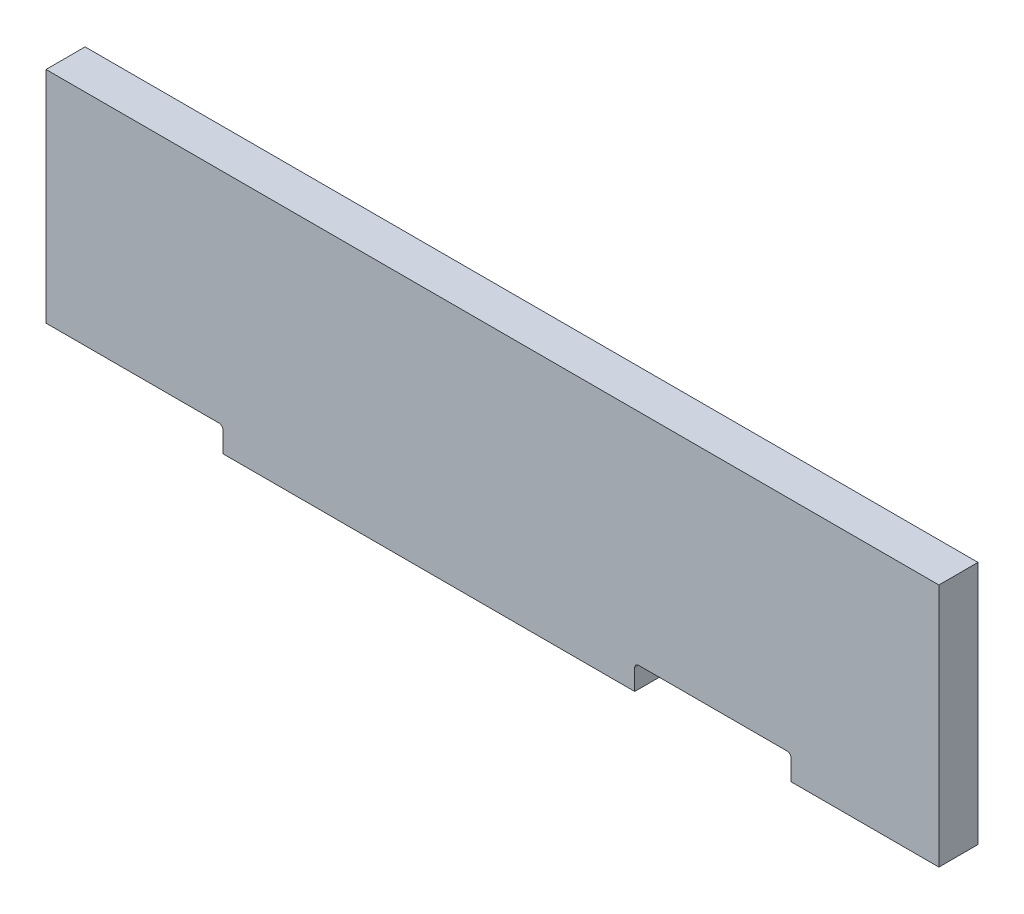
ISO-10303-21;
HEADER;
FILE_DESCRIPTION(('STEP AP214'),'2;1');
FILE_NAME('part.step','',(''),(''),'','','');
FILE_SCHEMA(('AUTOMOTIVE_DESIGN { 1 0 10303 214 1 1 1 1 }'));
ENDSEC;
DATA;
#1=APPLICATION_CONTEXT('core data for automotive mechanical design processes');
#2=APPLICATION_PROTOCOL_DEFINITION('international standard','automotive_design',2000,#1);
#3=PRODUCT_CONTEXT('',#1,'mechanical');
#4=PRODUCT('Part','Part','',(#3));
#5=PRODUCT_RELATED_PRODUCT_CATEGORY('part','',(#4));
#6=PRODUCT_DEFINITION_FORMATION('','',#4);
#7=PRODUCT_DEFINITION_CONTEXT('part definition',#1,'design');
#8=PRODUCT_DEFINITION('design','',#6,#7);
#9=PRODUCT_DEFINITION_SHAPE('','',#8);
#10=(LENGTH_UNIT() NAMED_UNIT(*) SI_UNIT(.MILLI.,.METRE.));
#11=(NAMED_UNIT(*) PLANE_ANGLE_UNIT() SI_UNIT($,.RADIAN.));
#12=(NAMED_UNIT(*) SI_UNIT($,.STERADIAN.) SOLID_ANGLE_UNIT());
#13=UNCERTAINTY_MEASURE_WITH_UNIT(LENGTH_MEASURE(1.E-05),#10,'distance_accuracy_value','');
#14=(GEOMETRIC_REPRESENTATION_CONTEXT(3) GLOBAL_UNCERTAINTY_ASSIGNED_CONTEXT((#13)) GLOBAL_UNIT_ASSIGNED_CONTEXT((#10,
#11,#12)) REPRESENTATION_CONTEXT('',''));
#15=CARTESIAN_POINT('',(0.,0.,0.));
#16=DIRECTION('',(0.,0.,1.));
#17=DIRECTION('',(1.,0.,0.));
#18=AXIS2_PLACEMENT_3D('',#15,#16,#17);
#19=CARTESIAN_POINT('',(300.,0.,19.05));
#20=DIRECTION('',(0.,1.,0.));
#21=DIRECTION('',(0.,0.,1.));
#22=AXIS2_PLACEMENT_3D('',#19,#20,#21);
#23=PLANE('',#22);
#24=DIRECTION('',(1.,0.,0.));
#25=VECTOR('',#24,1.);
#26=CARTESIAN_POINT('',(300.,0.,19.05));
#27=LINE('',#26,#25);
#28=CARTESIAN_POINT('',(-48.8000000000001,0.,19.05));
#29=VERTEX_POINT('',#28);
#30=CARTESIAN_POINT('',(151.8,0.,19.05));
#31=VERTEX_POINT('',#30);
#32=EDGE_CURVE('E140',#29,#31,#27,.T.);
#33=ORIENTED_EDGE('',*,*,#32,.F.);
#34=DIRECTION('',(0.,0.,1.));
#35=VECTOR('',#34,1.);
#36=CARTESIAN_POINT('',(-48.8000000000001,0.,0.));
#37=LINE('',#36,#35);
#38=CARTESIAN_POINT('',(-48.8000000000001,0.,0.));
#39=VERTEX_POINT('',#38);
#40=EDGE_CURVE('E127',#39,#29,#37,.T.);
#41=ORIENTED_EDGE('',*,*,#40,.F.);
#42=DIRECTION('',(1.,0.,0.));
#43=VECTOR('',#42,1.);
#44=CARTESIAN_POINT('',(300.,0.,0.));
#45=LINE('',#44,#43);
#46=CARTESIAN_POINT('',(151.8,0.,0.));
#47=VERTEX_POINT('',#46);
#48=EDGE_CURVE('E138',#39,#47,#45,.T.);
#49=ORIENTED_EDGE('',*,*,#48,.T.);
#50=DIRECTION('',(0.,0.,1.));
#51=VECTOR('',#50,1.);
#52=CARTESIAN_POINT('',(151.8,0.,0.));
#53=LINE('',#52,#51);
#54=EDGE_CURVE('E221',#47,#31,#53,.T.);
#55=ORIENTED_EDGE('',*,*,#54,.T.);
#56=EDGE_LOOP('',(#33,#41,#49,#55));
#57=FACE_BOUND('',#56,.T.);
#58=ADVANCED_FACE('F33',(#57),#23,.F.);
#59=CARTESIAN_POINT('',(300.,0.,19.05));
#60=DIRECTION('',(-1.,0.,0.));
#61=DIRECTION('',(0.,0.,1.));
#62=AXIS2_PLACEMENT_3D('',#59,#60,#61);
#63=PLANE('',#62);
#64=DIRECTION('',(0.,1.,0.));
#65=VECTOR('',#64,1.);
#66=CARTESIAN_POINT('',(300.,0.,0.));
#67=LINE('',#66,#65);
#68=CARTESIAN_POINT('',(300.,0.,0.));
#69=VERTEX_POINT('',#68);
#70=CARTESIAN_POINT('',(300.,119.05,0.));
#71=VERTEX_POINT('',#70);
#72=EDGE_CURVE('E231',#69,#71,#67,.T.);
#73=ORIENTED_EDGE('',*,*,#72,.T.);
#74=DIRECTION('',(0.,0.,-1.));
#75=VECTOR('',#74,1.);
#76=CARTESIAN_POINT('',(300.,119.05,19.05));
#77=LINE('',#76,#75);
#78=CARTESIAN_POINT('',(300.,119.05,19.05));
#79=VERTEX_POINT('',#78);
#80=EDGE_CURVE('E163',#79,#71,#77,.T.);
#81=ORIENTED_EDGE('',*,*,#80,.F.);
#82=DIRECTION('',(0.,1.,0.));
#83=VECTOR('',#82,1.);
#84=CARTESIAN_POINT('',(300.,0.,19.05));
#85=LINE('',#84,#83);
#86=CARTESIAN_POINT('',(300.,0.,19.05));
#87=VERTEX_POINT('',#86);
#88=EDGE_CURVE('E147',#87,#79,#85,.T.);
#89=ORIENTED_EDGE('',*,*,#88,.F.);
#90=DIRECTION('',(0.,0.,-1.));
#91=VECTOR('',#90,1.);
#92=CARTESIAN_POINT('',(300.,0.,19.05));
#93=LINE('',#92,#91);
#94=EDGE_CURVE('E157',#87,#69,#93,.T.);
#95=ORIENTED_EDGE('',*,*,#94,.T.);
#96=EDGE_LOOP('',(#73,#81,#89,#95));
#97=FACE_BOUND('',#96,.T.);
#98=ADVANCED_FACE('F258',(#97),#63,.F.);
#99=CARTESIAN_POINT('',(300.,119.05,19.05));
#100=DIRECTION('',(0.,-1.,0.));
#101=DIRECTION('',(0.,0.,-1.));
#102=AXIS2_PLACEMENT_3D('',#99,#100,#101);
#103=PLANE('',#102);
#104=DIRECTION('',(-1.,0.,0.));
#105=VECTOR('',#104,1.);
#106=CARTESIAN_POINT('',(300.,119.05,0.));
#107=LINE('',#106,#105);
#108=CARTESIAN_POINT('',(-135.,119.05,0.));
#109=VERTEX_POINT('',#108);
#110=EDGE_CURVE('E233',#71,#109,#107,.T.);
#111=ORIENTED_EDGE('',*,*,#110,.T.);
#112=DIRECTION('',(0.,0.,-1.));
#113=VECTOR('',#112,1.);
#114=CARTESIAN_POINT('',(-135.,119.05,19.05));
#115=LINE('',#114,#113);
#116=CARTESIAN_POINT('',(-135.,119.05,19.05));
#117=VERTEX_POINT('',#116);
#118=EDGE_CURVE('E160',#117,#109,#115,.T.);
#119=ORIENTED_EDGE('',*,*,#118,.F.);
#120=DIRECTION('',(-1.,0.,0.));
#121=VECTOR('',#120,1.);
#122=CARTESIAN_POINT('',(300.,119.05,19.05));
#123=LINE('',#122,#121);
#124=EDGE_CURVE('E151',#79,#117,#123,.T.);
#125=ORIENTED_EDGE('',*,*,#124,.F.);
#126=ORIENTED_EDGE('',*,*,#80,.T.);
#127=EDGE_LOOP('',(#111,#119,#125,#126));
#128=FACE_BOUND('',#127,.T.);
#129=ADVANCED_FACE('F256',(#128),#103,.F.);
#130=CARTESIAN_POINT('',(-135.,0.,19.05));
#131=DIRECTION('',(1.,0.,0.));
#132=DIRECTION('',(0.,0.,-1.));
#133=AXIS2_PLACEMENT_3D('',#130,#131,#132);
#134=PLANE('',#133);
#135=DIRECTION('',(0.,-1.,0.));
#136=VECTOR('',#135,1.);
#137=CARTESIAN_POINT('',(-135.,0.,0.));
#138=LINE('',#137,#136);
#139=CARTESIAN_POINT('',(-135.,12.,0.));
#140=VERTEX_POINT('',#139);
#141=EDGE_CURVE('E153',#109,#140,#138,.T.);
#142=ORIENTED_EDGE('',*,*,#141,.T.);
#143=DIRECTION('',(0.,0.,1.));
#144=VECTOR('',#143,1.);
#145=CARTESIAN_POINT('',(-135.,12.,0.));
#146=LINE('',#145,#144);
#147=CARTESIAN_POINT('',(-135.,12.,19.05));
#148=VERTEX_POINT('',#147);
#149=EDGE_CURVE('E141',#140,#148,#146,.T.);
#150=ORIENTED_EDGE('',*,*,#149,.T.);
#151=DIRECTION('',(0.,-1.,0.));
#152=VECTOR('',#151,1.);
#153=CARTESIAN_POINT('',(-135.,0.,19.05));
#154=LINE('',#153,#152);
#155=EDGE_CURVE('E226',#117,#148,#154,.T.);
#156=ORIENTED_EDGE('',*,*,#155,.F.);
#157=ORIENTED_EDGE('',*,*,#118,.T.);
#158=EDGE_LOOP('',(#142,#150,#156,#157));
#159=FACE_BOUND('',#158,.T.);
#160=ADVANCED_FACE('F240',(#159),#134,.F.);
#161=CARTESIAN_POINT('',(228.,0.,19.05));
#162=VERTEX_POINT('',#161);
#163=EDGE_CURVE('E229',#162,#87,#27,.T.);
#164=ORIENTED_EDGE('',*,*,#163,.F.);
#165=DIRECTION('',(0.,0.,1.));
#166=VECTOR('',#165,1.);
#167=CARTESIAN_POINT('',(228.,0.,0.));
#168=LINE('',#167,#166);
#169=CARTESIAN_POINT('',(228.,0.,0.));
#170=VERTEX_POINT('',#169);
#171=EDGE_CURVE('E214',#170,#162,#168,.T.);
#172=ORIENTED_EDGE('',*,*,#171,.F.);
#173=EDGE_CURVE('E148',#170,#69,#45,.T.);
#174=ORIENTED_EDGE('',*,*,#173,.T.);
#175=ORIENTED_EDGE('',*,*,#94,.F.);
#176=EDGE_LOOP('',(#164,#172,#174,#175));
#177=FACE_BOUND('',#176,.T.);
#178=ADVANCED_FACE('F264',(#177),#23,.F.);
#179=CARTESIAN_POINT('',(0.,0.,19.05));
#180=DIRECTION('',(0.,0.,1.));
#181=DIRECTION('',(1.,0.,0.));
#182=AXIS2_PLACEMENT_3D('',#179,#180,#181);
#183=PLANE('',#182);
#184=DIRECTION('',(-1.,0.,0.));
#185=VECTOR('',#184,1.);
#186=CARTESIAN_POINT('',(-125.,12.,19.05));
#187=LINE('',#186,#185);
#188=CARTESIAN_POINT('',(-50.8000000000001,12.,19.05));
#189=VERTEX_POINT('',#188);
#190=EDGE_CURVE('E132',#189,#148,#187,.T.);
#191=ORIENTED_EDGE('',*,*,#190,.F.);
#192=CARTESIAN_POINT('',(-50.8000000000001,10.,19.05));
#193=DIRECTION('',(0.,0.,1.));
#194=DIRECTION('',(1.,0.,0.));
#195=AXIS2_PLACEMENT_3D('',#192,#193,#194);
#196=CIRCLE('',#195,2.);
#197=CARTESIAN_POINT('',(-48.8000000000001,9.99999999999999,19.05));
#198=VERTEX_POINT('',#197);
#199=EDGE_CURVE('E41',#189,#198,#196,.F.);
#200=ORIENTED_EDGE('',*,*,#199,.T.);
#201=DIRECTION('',(0.,1.,0.));
#202=VECTOR('',#201,1.);
#203=CARTESIAN_POINT('',(-48.8000000000001,0.,19.05));
#204=LINE('',#203,#202);
#205=EDGE_CURVE('E223',#29,#198,#204,.T.);
#206=ORIENTED_EDGE('',*,*,#205,.F.);
#207=ORIENTED_EDGE('',*,*,#32,.T.);
#208=DIRECTION('',(0.,-1.,0.));
#209=VECTOR('',#208,1.);
#210=CARTESIAN_POINT('',(151.8,0.,19.05));
#211=LINE('',#210,#209);
#212=CARTESIAN_POINT('',(151.8,9.99999999999996,19.05));
#213=VERTEX_POINT('',#212);
#214=EDGE_CURVE('E216',#213,#31,#211,.T.);
#215=ORIENTED_EDGE('',*,*,#214,.F.);
#216=CARTESIAN_POINT('',(153.8,9.99999999999996,19.05));
#217=DIRECTION('',(0.,0.,1.));
#218=DIRECTION('',(1.,0.,0.));
#219=AXIS2_PLACEMENT_3D('',#216,#217,#218);
#220=CIRCLE('',#219,2.);
#221=CARTESIAN_POINT('',(153.8,12.,19.05));
#222=VERTEX_POINT('',#221);
#223=EDGE_CURVE('E180',#213,#222,#220,.F.);
#224=ORIENTED_EDGE('',*,*,#223,.T.);
#225=DIRECTION('',(-1.,0.,0.));
#226=VECTOR('',#225,1.);
#227=CARTESIAN_POINT('',(151.8,12.,19.05));
#228=LINE('',#227,#226);
#229=CARTESIAN_POINT('',(226.,12.,19.05));
#230=VERTEX_POINT('',#229);
#231=EDGE_CURVE('E210',#230,#222,#228,.T.);
#232=ORIENTED_EDGE('',*,*,#231,.F.);
#233=CARTESIAN_POINT('',(226.,9.99999999999996,19.05));
#234=DIRECTION('',(0.,0.,1.));
#235=DIRECTION('',(1.,0.,0.));
#236=AXIS2_PLACEMENT_3D('',#233,#234,#235);
#237=CIRCLE('',#236,2.);
#238=CARTESIAN_POINT('',(228.,9.99999999999996,19.05));
#239=VERTEX_POINT('',#238);
#240=EDGE_CURVE('E184',#230,#239,#237,.F.);
#241=ORIENTED_EDGE('',*,*,#240,.T.);
#242=DIRECTION('',(0.,1.,0.));
#243=VECTOR('',#242,1.);
#244=CARTESIAN_POINT('',(228.,12.,19.05));
#245=LINE('',#244,#243);
#246=EDGE_CURVE('E208',#162,#239,#245,.T.);
#247=ORIENTED_EDGE('',*,*,#246,.F.);
#248=ORIENTED_EDGE('',*,*,#163,.T.);
#249=ORIENTED_EDGE('',*,*,#88,.T.);
#250=ORIENTED_EDGE('',*,*,#124,.T.);
#251=ORIENTED_EDGE('',*,*,#155,.T.);
#252=EDGE_LOOP('',(#191,#200,#206,#207,#215,#224,#232,#241,#247,#248,#249,#250,#251));
#253=FACE_BOUND('',#252,.T.);
#254=ADVANCED_FACE('F207',(#253),#183,.T.);
#255=CARTESIAN_POINT('',(0.,0.,0.));
#256=DIRECTION('',(0.,0.,1.));
#257=DIRECTION('',(1.,0.,0.));
#258=AXIS2_PLACEMENT_3D('',#255,#256,#257);
#259=PLANE('',#258);
#260=DIRECTION('',(0.,1.,0.));
#261=VECTOR('',#260,1.);
#262=CARTESIAN_POINT('',(-48.8000000000001,0.,0.));
#263=LINE('',#262,#261);
#264=CARTESIAN_POINT('',(-48.8000000000001,9.99999999999999,0.));
#265=VERTEX_POINT('',#264);
#266=EDGE_CURVE('E124',#39,#265,#263,.T.);
#267=ORIENTED_EDGE('',*,*,#266,.T.);
#268=CARTESIAN_POINT('',(-50.8000000000001,10.,0.));
#269=DIRECTION('',(0.,0.,1.));
#270=DIRECTION('',(1.,0.,0.));
#271=AXIS2_PLACEMENT_3D('',#268,#269,#270);
#272=CIRCLE('',#271,2.);
#273=CARTESIAN_POINT('',(-50.8000000000001,12.,0.));
#274=VERTEX_POINT('',#273);
#275=EDGE_CURVE('E11',#265,#274,#272,.T.);
#276=ORIENTED_EDGE('',*,*,#275,.T.);
#277=DIRECTION('',(-1.,0.,0.));
#278=VECTOR('',#277,1.);
#279=CARTESIAN_POINT('',(-48.8000000000001,12.,0.));
#280=LINE('',#279,#278);
#281=EDGE_CURVE('E131',#274,#140,#280,.T.);
#282=ORIENTED_EDGE('',*,*,#281,.T.);
#283=ORIENTED_EDGE('',*,*,#141,.F.);
#284=ORIENTED_EDGE('',*,*,#110,.F.);
#285=ORIENTED_EDGE('',*,*,#72,.F.);
#286=ORIENTED_EDGE('',*,*,#173,.F.);
#287=DIRECTION('',(0.,1.,0.));
#288=VECTOR('',#287,1.);
#289=CARTESIAN_POINT('',(228.,12.,0.));
#290=LINE('',#289,#288);
#291=CARTESIAN_POINT('',(228.,9.99999999999996,0.));
#292=VERTEX_POINT('',#291);
#293=EDGE_CURVE('E194',#170,#292,#290,.T.);
#294=ORIENTED_EDGE('',*,*,#293,.T.);
#295=CARTESIAN_POINT('',(226.,9.99999999999996,0.));
#296=DIRECTION('',(0.,0.,1.));
#297=DIRECTION('',(1.,0.,0.));
#298=AXIS2_PLACEMENT_3D('',#295,#296,#297);
#299=CIRCLE('',#298,2.);
#300=CARTESIAN_POINT('',(226.,12.,0.));
#301=VERTEX_POINT('',#300);
#302=EDGE_CURVE('E186',#292,#301,#299,.T.);
#303=ORIENTED_EDGE('',*,*,#302,.T.);
#304=DIRECTION('',(-1.,0.,0.));
#305=VECTOR('',#304,1.);
#306=CARTESIAN_POINT('',(151.8,12.,0.));
#307=LINE('',#306,#305);
#308=CARTESIAN_POINT('',(153.8,12.,0.));
#309=VERTEX_POINT('',#308);
#310=EDGE_CURVE('E191',#301,#309,#307,.T.);
#311=ORIENTED_EDGE('',*,*,#310,.T.);
#312=CARTESIAN_POINT('',(153.8,9.99999999999996,0.));
#313=DIRECTION('',(0.,0.,1.));
#314=DIRECTION('',(1.,0.,0.));
#315=AXIS2_PLACEMENT_3D('',#312,#313,#314);
#316=CIRCLE('',#315,2.);
#317=CARTESIAN_POINT('',(151.8,9.99999999999996,0.));
#318=VERTEX_POINT('',#317);
#319=EDGE_CURVE('E182',#309,#318,#316,.T.);
#320=ORIENTED_EDGE('',*,*,#319,.T.);
#321=DIRECTION('',(0.,-1.,0.));
#322=VECTOR('',#321,1.);
#323=CARTESIAN_POINT('',(151.8,0.,0.));
#324=LINE('',#323,#322);
#325=EDGE_CURVE('E145',#318,#47,#324,.T.);
#326=ORIENTED_EDGE('',*,*,#325,.T.);
#327=ORIENTED_EDGE('',*,*,#48,.F.);
#328=EDGE_LOOP('',(#267,#276,#282,#283,#284,#285,#286,#294,#303,#311,#320,#326,#327));
#329=FACE_BOUND('',#328,.T.);
#330=ADVANCED_FACE('F143',(#329),#259,.F.);
#331=CARTESIAN_POINT('',(151.8,0.,0.));
#332=DIRECTION('',(-1.,0.,0.));
#333=DIRECTION('',(0.,0.,1.));
#334=AXIS2_PLACEMENT_3D('',#331,#332,#333);
#335=PLANE('',#334);
#336=ORIENTED_EDGE('',*,*,#325,.F.);
#337=DIRECTION('',(0.,0.,1.));
#338=VECTOR('',#337,1.);
#339=CARTESIAN_POINT('',(151.8,9.99999999999996,19.05));
#340=LINE('',#339,#338);
#341=EDGE_CURVE('E166',#318,#213,#340,.T.);
#342=ORIENTED_EDGE('',*,*,#341,.T.);
#343=ORIENTED_EDGE('',*,*,#214,.T.);
#344=ORIENTED_EDGE('',*,*,#54,.F.);
#345=EDGE_LOOP('',(#336,#342,#343,#344));
#346=FACE_BOUND('',#345,.T.);
#347=ADVANCED_FACE('F283',(#346),#335,.F.);
#348=CARTESIAN_POINT('',(151.8,12.,0.));
#349=DIRECTION('',(0.,1.,0.));
#350=DIRECTION('',(0.,0.,1.));
#351=AXIS2_PLACEMENT_3D('',#348,#349,#350);
#352=PLANE('',#351);
#353=ORIENTED_EDGE('',*,*,#231,.T.);
#354=DIRECTION('',(0.,0.,1.));
#355=VECTOR('',#354,1.);
#356=CARTESIAN_POINT('',(153.8,12.,0.));
#357=LINE('',#356,#355);
#358=EDGE_CURVE('E172',#222,#309,#357,.F.);
#359=ORIENTED_EDGE('',*,*,#358,.T.);
#360=ORIENTED_EDGE('',*,*,#310,.F.);
#361=DIRECTION('',(0.,0.,1.));
#362=VECTOR('',#361,1.);
#363=CARTESIAN_POINT('',(226.,12.,19.05));
#364=LINE('',#363,#362);
#365=EDGE_CURVE('E169',#301,#230,#364,.T.);
#366=ORIENTED_EDGE('',*,*,#365,.T.);
#367=EDGE_LOOP('',(#353,#359,#360,#366));
#368=FACE_BOUND('',#367,.T.);
#369=ADVANCED_FACE('F200',(#368),#352,.F.);
#370=CARTESIAN_POINT('',(228.,12.,0.));
#371=DIRECTION('',(1.,0.,0.));
#372=DIRECTION('',(0.,0.,-1.));
#373=AXIS2_PLACEMENT_3D('',#370,#371,#372);
#374=PLANE('',#373);
#375=ORIENTED_EDGE('',*,*,#246,.T.);
#376=DIRECTION('',(0.,0.,1.));
#377=VECTOR('',#376,1.);
#378=CARTESIAN_POINT('',(228.,9.99999999999996,0.));
#379=LINE('',#378,#377);
#380=EDGE_CURVE('E174',#239,#292,#379,.F.);
#381=ORIENTED_EDGE('',*,*,#380,.T.);
#382=ORIENTED_EDGE('',*,*,#293,.F.);
#383=ORIENTED_EDGE('',*,*,#171,.T.);
#384=EDGE_LOOP('',(#375,#381,#382,#383));
#385=FACE_BOUND('',#384,.T.);
#386=ADVANCED_FACE('F212',(#385),#374,.F.);
#387=CARTESIAN_POINT('',(-125.,12.,0.));
#388=DIRECTION('',(0.,1.,0.));
#389=DIRECTION('',(0.,0.,1.));
#390=AXIS2_PLACEMENT_3D('',#387,#388,#389);
#391=PLANE('',#390);
#392=ORIENTED_EDGE('',*,*,#281,.F.);
#393=DIRECTION('',(0.,0.,1.));
#394=VECTOR('',#393,1.);
#395=CARTESIAN_POINT('',(-50.8000000000001,12.,19.05));
#396=LINE('',#395,#394);
#397=EDGE_CURVE('E176',#274,#189,#396,.T.);
#398=ORIENTED_EDGE('',*,*,#397,.T.);
#399=ORIENTED_EDGE('',*,*,#190,.T.);
#400=ORIENTED_EDGE('',*,*,#149,.F.);
#401=EDGE_LOOP('',(#392,#398,#399,#400));
#402=FACE_BOUND('',#401,.T.);
#403=ADVANCED_FACE('F248',(#402),#391,.F.);
#404=CARTESIAN_POINT('',(-48.8000000000001,0.,0.));
#405=DIRECTION('',(1.,0.,0.));
#406=DIRECTION('',(0.,1.,0.));
#407=AXIS2_PLACEMENT_3D('',#404,#405,#406);
#408=PLANE('',#407);
#409=ORIENTED_EDGE('',*,*,#205,.T.);
#410=DIRECTION('',(0.,0.,1.));
#411=VECTOR('',#410,1.);
#412=CARTESIAN_POINT('',(-48.8000000000001,9.99999999999999,0.));
#413=LINE('',#412,#411);
#414=EDGE_CURVE('E48',#198,#265,#413,.F.);
#415=ORIENTED_EDGE('',*,*,#414,.T.);
#416=ORIENTED_EDGE('',*,*,#266,.F.);
#417=ORIENTED_EDGE('',*,*,#40,.T.);
#418=EDGE_LOOP('',(#409,#415,#416,#417));
#419=FACE_BOUND('',#418,.T.);
#420=ADVANCED_FACE('F126',(#419),#408,.F.);
#421=CARTESIAN_POINT('',(153.8,9.99999999999996,0.));
#422=DIRECTION('',(0.,0.,-1.));
#423=DIRECTION('',(-1.,0.,0.));
#424=AXIS2_PLACEMENT_3D('',#421,#422,#423);
#425=CYLINDRICAL_SURFACE('',#424,2.);
#426=ORIENTED_EDGE('',*,*,#319,.F.);
#427=ORIENTED_EDGE('',*,*,#358,.F.);
#428=ORIENTED_EDGE('',*,*,#223,.F.);
#429=ORIENTED_EDGE('',*,*,#341,.F.);
#430=EDGE_LOOP('',(#426,#427,#428,#429));
#431=FACE_BOUND('',#430,.T.);
#432=ADVANCED_FACE('F294',(#431),#425,.F.);
#433=CARTESIAN_POINT('',(226.,9.99999999999996,0.));
#434=DIRECTION('',(0.,0.,-1.));
#435=DIRECTION('',(-1.,0.,0.));
#436=AXIS2_PLACEMENT_3D('',#433,#434,#435);
#437=CYLINDRICAL_SURFACE('',#436,2.);
#438=ORIENTED_EDGE('',*,*,#302,.F.);
#439=ORIENTED_EDGE('',*,*,#380,.F.);
#440=ORIENTED_EDGE('',*,*,#240,.F.);
#441=ORIENTED_EDGE('',*,*,#365,.F.);
#442=EDGE_LOOP('',(#438,#439,#440,#441));
#443=FACE_BOUND('',#442,.T.);
#444=ADVANCED_FACE('F204',(#443),#437,.F.);
#445=CARTESIAN_POINT('',(-50.8000000000001,10.,0.));
#446=DIRECTION('',(0.,0.,-1.));
#447=DIRECTION('',(-1.,0.,0.));
#448=AXIS2_PLACEMENT_3D('',#445,#446,#447);
#449=CYLINDRICAL_SURFACE('',#448,2.);
#450=ORIENTED_EDGE('',*,*,#275,.F.);
#451=ORIENTED_EDGE('',*,*,#414,.F.);
#452=ORIENTED_EDGE('',*,*,#199,.F.);
#453=ORIENTED_EDGE('',*,*,#397,.F.);
#454=EDGE_LOOP('',(#450,#451,#452,#453));
#455=FACE_BOUND('',#454,.T.);
#456=ADVANCED_FACE('F35',(#455),#449,.F.);
#457=CLOSED_SHELL('',(#58,#98,#129,#160,#178,#254,#330,#347,#369,#386,#403,#420,#432,#444,#456));
#458=MANIFOLD_SOLID_BREP('B2',#457);
#459=ADVANCED_BREP_SHAPE_REPRESENTATION('',(#18,#458),#14);
#460=SHAPE_DEFINITION_REPRESENTATION(#9,#459);
ENDSEC;
END-ISO-10303-21;
